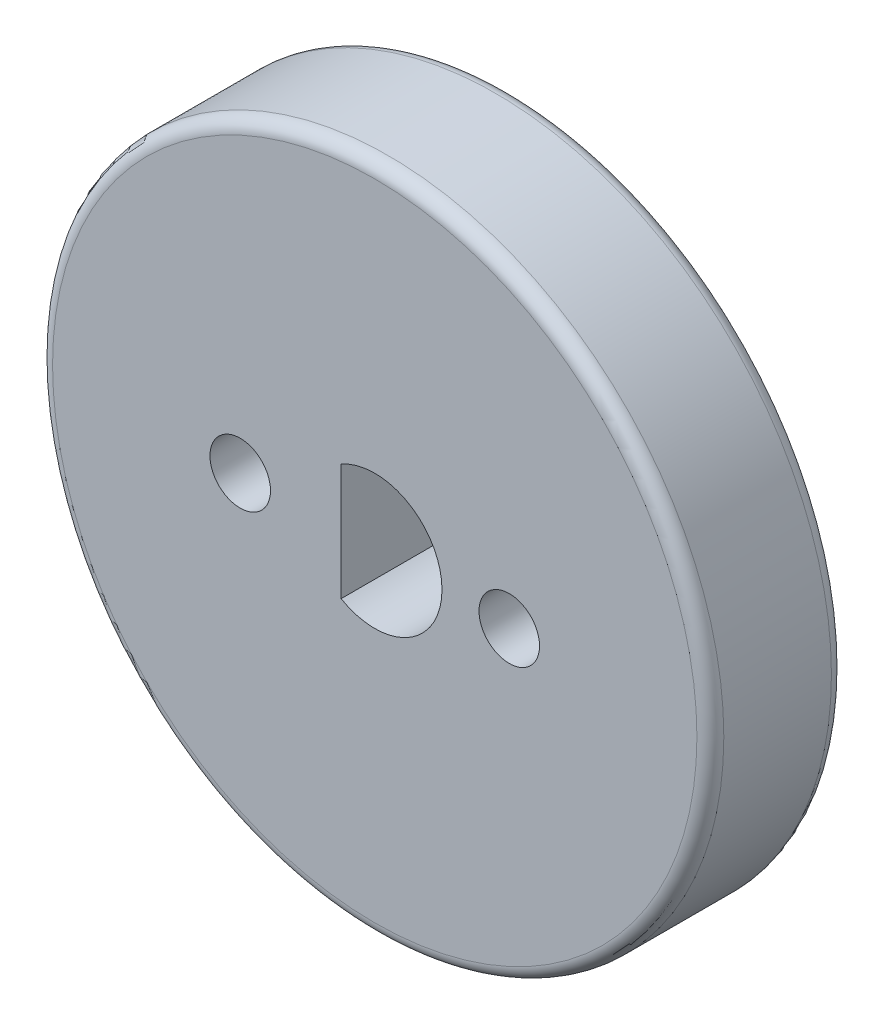
ISO-10303-21;
HEADER;
FILE_DESCRIPTION(('STEP AP214'),'2;1');
FILE_NAME('part.step','',(''),(''),'','','');
FILE_SCHEMA(('AUTOMOTIVE_DESIGN { 1 0 10303 214 1 1 1 1 }'));
ENDSEC;
DATA;
#1=APPLICATION_CONTEXT('core data for automotive mechanical design processes');
#2=APPLICATION_PROTOCOL_DEFINITION('international standard','automotive_design',2000,#1);
#3=PRODUCT_CONTEXT('',#1,'mechanical');
#4=PRODUCT('Part','Part','',(#3));
#5=PRODUCT_RELATED_PRODUCT_CATEGORY('part','',(#4));
#6=PRODUCT_DEFINITION_FORMATION('','',#4);
#7=PRODUCT_DEFINITION_CONTEXT('part definition',#1,'design');
#8=PRODUCT_DEFINITION('design','',#6,#7);
#9=PRODUCT_DEFINITION_SHAPE('','',#8);
#10=(LENGTH_UNIT() NAMED_UNIT(*) SI_UNIT(.MILLI.,.METRE.));
#11=(NAMED_UNIT(*) PLANE_ANGLE_UNIT() SI_UNIT($,.RADIAN.));
#12=(NAMED_UNIT(*) SI_UNIT($,.STERADIAN.) SOLID_ANGLE_UNIT());
#13=UNCERTAINTY_MEASURE_WITH_UNIT(LENGTH_MEASURE(1.E-05),#10,'distance_accuracy_value','');
#14=(GEOMETRIC_REPRESENTATION_CONTEXT(3) GLOBAL_UNCERTAINTY_ASSIGNED_CONTEXT((#13)) GLOBAL_UNIT_ASSIGNED_CONTEXT((#10,
#11,#12)) REPRESENTATION_CONTEXT('',''));
#15=CARTESIAN_POINT('',(0.,0.,0.));
#16=DIRECTION('',(0.,0.,1.));
#17=DIRECTION('',(1.,0.,0.));
#18=AXIS2_PLACEMENT_3D('',#15,#16,#17);
#19=CARTESIAN_POINT('',(0.,0.,0.));
#20=DIRECTION('',(0.,0.,1.));
#21=DIRECTION('',(1.,0.,0.));
#22=AXIS2_PLACEMENT_3D('',#19,#20,#21);
#23=PLANE('',#22);
#24=CARTESIAN_POINT('',(0.,0.,0.));
#25=DIRECTION('',(0.,0.,1.));
#26=DIRECTION('',(1.,0.,0.));
#27=AXIS2_PLACEMENT_3D('',#24,#25,#26);
#28=CIRCLE('',#27,23.95);
#29=CARTESIAN_POINT('',(23.95,0.,0.));
#30=VERTEX_POINT('',#29);
#31=EDGE_CURVE('E11',#30,#30,#28,.F.);
#32=ORIENTED_EDGE('',*,*,#31,.T.);
#33=EDGE_LOOP('',(#32));
#34=FACE_BOUND('',#33,.T.);
#35=CARTESIAN_POINT('',(0.,15.,0.));
#36=DIRECTION('',(0.,0.,1.));
#37=DIRECTION('',(1.,0.,0.));
#38=AXIS2_PLACEMENT_3D('',#35,#36,#37);
#39=CIRCLE('',#38,2.25);
#40=CARTESIAN_POINT('',(2.25,15.,0.));
#41=VERTEX_POINT('',#40);
#42=EDGE_CURVE('E104',#41,#41,#39,.T.);
#43=ORIENTED_EDGE('',*,*,#42,.T.);
#44=EDGE_LOOP('',(#43));
#45=FACE_BOUND('',#44,.T.);
#46=CARTESIAN_POINT('',(0.,0.,0.));
#47=DIRECTION('',(0.,0.,1.));
#48=DIRECTION('',(1.,0.,0.));
#49=AXIS2_PLACEMENT_3D('',#46,#47,#48);
#50=CIRCLE('',#49,5.);
#51=CARTESIAN_POINT('',(-2.50000000000002,-4.33012701892218,0.));
#52=VERTEX_POINT('',#51);
#53=CARTESIAN_POINT('',(-2.50000000000002,4.33012701892218,0.));
#54=VERTEX_POINT('',#53);
#55=EDGE_CURVE('E61',#52,#54,#50,.T.);
#56=ORIENTED_EDGE('',*,*,#55,.T.);
#57=DIRECTION('',(0.,-1.,0.));
#58=VECTOR('',#57,1.);
#59=CARTESIAN_POINT('',(-2.50000000000002,-4.33012701892218,0.));
#60=LINE('',#59,#58);
#61=EDGE_CURVE('E72',#54,#52,#60,.T.);
#62=ORIENTED_EDGE('',*,*,#61,.T.);
#63=EDGE_LOOP('',(#56,#62));
#64=FACE_BOUND('',#63,.T.);
#65=CARTESIAN_POINT('',(12.9903810567666,-7.49999999999999,0.));
#66=DIRECTION('',(0.,0.,1.));
#67=DIRECTION('',(1.,0.,0.));
#68=AXIS2_PLACEMENT_3D('',#65,#66,#67);
#69=CIRCLE('',#68,2.25);
#70=CARTESIAN_POINT('',(15.2403810567666,-7.49999999999999,0.));
#71=VERTEX_POINT('',#70);
#72=EDGE_CURVE('E95',#71,#71,#69,.T.);
#73=ORIENTED_EDGE('',*,*,#72,.T.);
#74=EDGE_LOOP('',(#73));
#75=FACE_BOUND('',#74,.T.);
#76=CARTESIAN_POINT('',(-12.9903810567666,-7.50000000000001,0.));
#77=DIRECTION('',(0.,0.,1.));
#78=DIRECTION('',(1.,0.,0.));
#79=AXIS2_PLACEMENT_3D('',#76,#77,#78);
#80=CIRCLE('',#79,2.25);
#81=CARTESIAN_POINT('',(-10.7403810567666,-7.50000000000001,0.));
#82=VERTEX_POINT('',#81);
#83=EDGE_CURVE('E92',#82,#82,#80,.T.);
#84=ORIENTED_EDGE('',*,*,#83,.T.);
#85=EDGE_LOOP('',(#84));
#86=FACE_BOUND('',#85,.T.);
#87=ADVANCED_FACE('F39',(#34,#45,#64,#75,#86),#23,.F.);
#88=CARTESIAN_POINT('',(0.,0.,6.));
#89=DIRECTION('',(0.,0.,-1.));
#90=DIRECTION('',(-1.,0.,0.));
#91=AXIS2_PLACEMENT_3D('',#88,#89,#90);
#92=CYLINDRICAL_SURFACE('',#91,24.95);
#93=CARTESIAN_POINT('',(0.,0.,9.));
#94=DIRECTION('',(0.,0.,1.));
#95=DIRECTION('',(1.,0.,0.));
#96=AXIS2_PLACEMENT_3D('',#93,#94,#95);
#97=CIRCLE('',#96,24.95);
#98=CARTESIAN_POINT('',(24.95,0.,9.));
#99=VERTEX_POINT('',#98);
#100=EDGE_CURVE('E47',#99,#99,#97,.F.);
#101=ORIENTED_EDGE('',*,*,#100,.T.);
#102=EDGE_LOOP('',(#101));
#103=FACE_BOUND('',#102,.T.);
#104=CARTESIAN_POINT('',(0.,0.,1.));
#105=DIRECTION('',(0.,0.,1.));
#106=DIRECTION('',(1.,0.,0.));
#107=AXIS2_PLACEMENT_3D('',#104,#105,#106);
#108=CIRCLE('',#107,24.95);
#109=CARTESIAN_POINT('',(24.95,0.,1.));
#110=VERTEX_POINT('',#109);
#111=EDGE_CURVE('E112',#110,#110,#108,.T.);
#112=ORIENTED_EDGE('',*,*,#111,.T.);
#113=EDGE_LOOP('',(#112));
#114=FACE_BOUND('',#113,.T.);
#115=ADVANCED_FACE('F117',(#103,#114),#92,.T.);
#116=CARTESIAN_POINT('',(0.,15.,6.));
#117=DIRECTION('',(0.,0.,-1.));
#118=DIRECTION('',(-1.,0.,0.));
#119=AXIS2_PLACEMENT_3D('',#116,#117,#118);
#120=CYLINDRICAL_SURFACE('',#119,2.25);
#121=CARTESIAN_POINT('',(0.,15.,6.));
#122=DIRECTION('',(0.,0.,1.));
#123=DIRECTION('',(1.,0.,0.));
#124=AXIS2_PLACEMENT_3D('',#121,#122,#123);
#125=CIRCLE('',#124,2.25);
#126=CARTESIAN_POINT('',(2.25,15.,6.));
#127=VERTEX_POINT('',#126);
#128=EDGE_CURVE('E91',#127,#127,#125,.T.);
#129=ORIENTED_EDGE('',*,*,#128,.T.);
#130=EDGE_LOOP('',(#129));
#131=FACE_BOUND('',#130,.T.);
#132=ORIENTED_EDGE('',*,*,#42,.F.);
#133=EDGE_LOOP('',(#132));
#134=FACE_BOUND('',#133,.T.);
#135=ADVANCED_FACE('F160',(#131,#134),#120,.F.);
#136=CARTESIAN_POINT('',(0.,0.,6.));
#137=DIRECTION('',(0.,0.,-1.));
#138=DIRECTION('',(-1.,0.,0.));
#139=AXIS2_PLACEMENT_3D('',#136,#137,#138);
#140=CYLINDRICAL_SURFACE('',#139,5.);
#141=ORIENTED_EDGE('',*,*,#55,.F.);
#142=DIRECTION('',(0.,0.,-1.));
#143=VECTOR('',#142,1.);
#144=CARTESIAN_POINT('',(-2.50000000000002,-4.33012701892218,6.));
#145=LINE('',#144,#143);
#146=CARTESIAN_POINT('',(-2.50000000000002,-4.33012701892218,10.));
#147=VERTEX_POINT('',#146);
#148=EDGE_CURVE('E66',#147,#52,#145,.T.);
#149=ORIENTED_EDGE('',*,*,#148,.F.);
#150=CARTESIAN_POINT('',(0.,0.,10.));
#151=DIRECTION('',(0.,0.,-1.));
#152=DIRECTION('',(-1.,0.,0.));
#153=AXIS2_PLACEMENT_3D('',#150,#151,#152);
#154=CIRCLE('',#153,5.);
#155=CARTESIAN_POINT('',(-2.50000000000002,4.33012701892218,10.));
#156=VERTEX_POINT('',#155);
#157=EDGE_CURVE('E69',#156,#147,#154,.T.);
#158=ORIENTED_EDGE('',*,*,#157,.F.);
#159=DIRECTION('',(0.,0.,-1.));
#160=VECTOR('',#159,1.);
#161=CARTESIAN_POINT('',(-2.50000000000002,4.33012701892218,6.));
#162=LINE('',#161,#160);
#163=EDGE_CURVE('E54',#156,#54,#162,.T.);
#164=ORIENTED_EDGE('',*,*,#163,.T.);
#165=EDGE_LOOP('',(#141,#149,#158,#164));
#166=FACE_BOUND('',#165,.T.);
#167=ADVANCED_FACE('F67',(#166),#140,.F.);
#168=CARTESIAN_POINT('',(-2.50000000000002,-4.33012701892218,6.));
#169=DIRECTION('',(1.,0.,0.));
#170=DIRECTION('',(0.,0.,-1.));
#171=AXIS2_PLACEMENT_3D('',#168,#169,#170);
#172=PLANE('',#171);
#173=ORIENTED_EDGE('',*,*,#61,.F.);
#174=ORIENTED_EDGE('',*,*,#163,.F.);
#175=DIRECTION('',(0.,1.,0.));
#176=VECTOR('',#175,1.);
#177=CARTESIAN_POINT('',(-2.50000000000002,4.33012701892218,10.));
#178=LINE('',#177,#176);
#179=EDGE_CURVE('E74',#147,#156,#178,.T.);
#180=ORIENTED_EDGE('',*,*,#179,.F.);
#181=ORIENTED_EDGE('',*,*,#148,.T.);
#182=EDGE_LOOP('',(#173,#174,#180,#181));
#183=FACE_BOUND('',#182,.T.);
#184=ADVANCED_FACE('F75',(#183),#172,.T.);
#185=CARTESIAN_POINT('',(12.9903810567666,-7.49999999999999,6.));
#186=DIRECTION('',(0.,0.,-1.));
#187=DIRECTION('',(-1.,0.,0.));
#188=AXIS2_PLACEMENT_3D('',#185,#186,#187);
#189=CYLINDRICAL_SURFACE('',#188,2.25);
#190=CARTESIAN_POINT('',(12.9903810567666,-7.49999999999999,6.));
#191=DIRECTION('',(0.,0.,1.));
#192=DIRECTION('',(1.,0.,0.));
#193=AXIS2_PLACEMENT_3D('',#190,#191,#192);
#194=CIRCLE('',#193,2.25);
#195=CARTESIAN_POINT('',(15.2403810567666,-7.49999999999999,6.));
#196=VERTEX_POINT('',#195);
#197=EDGE_CURVE('E96',#196,#196,#194,.T.);
#198=ORIENTED_EDGE('',*,*,#197,.T.);
#199=EDGE_LOOP('',(#198));
#200=FACE_BOUND('',#199,.T.);
#201=ORIENTED_EDGE('',*,*,#72,.F.);
#202=EDGE_LOOP('',(#201));
#203=FACE_BOUND('',#202,.T.);
#204=ADVANCED_FACE('F170',(#200,#203),#189,.F.);
#205=CARTESIAN_POINT('',(-12.9903810567666,-7.50000000000001,6.));
#206=DIRECTION('',(0.,0.,-1.));
#207=DIRECTION('',(-1.,0.,0.));
#208=AXIS2_PLACEMENT_3D('',#205,#206,#207);
#209=CYLINDRICAL_SURFACE('',#208,2.25);
#210=CARTESIAN_POINT('',(-12.9903810567666,-7.50000000000001,6.));
#211=DIRECTION('',(0.,0.,1.));
#212=DIRECTION('',(1.,0.,0.));
#213=AXIS2_PLACEMENT_3D('',#210,#211,#212);
#214=CIRCLE('',#213,2.25);
#215=CARTESIAN_POINT('',(-10.7403810567666,-7.50000000000001,6.));
#216=VERTEX_POINT('',#215);
#217=EDGE_CURVE('E77',#216,#216,#214,.T.);
#218=ORIENTED_EDGE('',*,*,#217,.T.);
#219=EDGE_LOOP('',(#218));
#220=FACE_BOUND('',#219,.T.);
#221=ORIENTED_EDGE('',*,*,#83,.F.);
#222=EDGE_LOOP('',(#221));
#223=FACE_BOUND('',#222,.T.);
#224=ADVANCED_FACE('F173',(#220,#223),#209,.F.);
#225=CARTESIAN_POINT('',(0.,0.,6.));
#226=DIRECTION('',(0.,0.,1.));
#227=DIRECTION('',(1.,0.,0.));
#228=AXIS2_PLACEMENT_3D('',#225,#226,#227);
#229=PLANE('',#228);
#230=ORIENTED_EDGE('',*,*,#217,.F.);
#231=EDGE_LOOP('',(#230));
#232=FACE_BOUND('',#231,.T.);
#233=ADVANCED_FACE('F177',(#232),#229,.F.);
#234=ORIENTED_EDGE('',*,*,#128,.F.);
#235=EDGE_LOOP('',(#234));
#236=FACE_BOUND('',#235,.T.);
#237=ADVANCED_FACE('F180',(#236),#229,.F.);
#238=ORIENTED_EDGE('',*,*,#197,.F.);
#239=EDGE_LOOP('',(#238));
#240=FACE_BOUND('',#239,.T.);
#241=ADVANCED_FACE('F129',(#240),#229,.F.);
#242=CARTESIAN_POINT('',(0.,0.,10.));
#243=DIRECTION('',(0.,0.,1.));
#244=DIRECTION('',(1.,0.,0.));
#245=AXIS2_PLACEMENT_3D('',#242,#243,#244);
#246=PLANE('',#245);
#247=CARTESIAN_POINT('',(0.,0.,10.));
#248=DIRECTION('',(0.,0.,1.));
#249=DIRECTION('',(1.,0.,0.));
#250=AXIS2_PLACEMENT_3D('',#247,#248,#249);
#251=CIRCLE('',#250,23.95);
#252=CARTESIAN_POINT('',(23.95,0.,10.));
#253=VERTEX_POINT('',#252);
#254=EDGE_CURVE('E109',#253,#253,#251,.T.);
#255=ORIENTED_EDGE('',*,*,#254,.T.);
#256=EDGE_LOOP('',(#255));
#257=FACE_BOUND('',#256,.T.);
#258=CARTESIAN_POINT('',(-10.,0.,10.));
#259=DIRECTION('',(0.,0.,1.));
#260=DIRECTION('',(1.,0.,0.));
#261=AXIS2_PLACEMENT_3D('',#258,#259,#260);
#262=CIRCLE('',#261,2.25);
#263=CARTESIAN_POINT('',(-7.75,0.,10.));
#264=VERTEX_POINT('',#263);
#265=EDGE_CURVE('E83',#264,#264,#262,.T.);
#266=ORIENTED_EDGE('',*,*,#265,.F.);
#267=EDGE_LOOP('',(#266));
#268=FACE_BOUND('',#267,.T.);
#269=CARTESIAN_POINT('',(10.,0.,10.));
#270=DIRECTION('',(0.,0.,1.));
#271=DIRECTION('',(1.,0.,0.));
#272=AXIS2_PLACEMENT_3D('',#269,#270,#271);
#273=CIRCLE('',#272,2.25);
#274=CARTESIAN_POINT('',(12.25,0.,10.));
#275=VERTEX_POINT('',#274);
#276=EDGE_CURVE('E136',#275,#275,#273,.T.);
#277=ORIENTED_EDGE('',*,*,#276,.F.);
#278=EDGE_LOOP('',(#277));
#279=FACE_BOUND('',#278,.T.);
#280=ORIENTED_EDGE('',*,*,#157,.T.);
#281=ORIENTED_EDGE('',*,*,#179,.T.);
#282=EDGE_LOOP('',(#280,#281));
#283=FACE_BOUND('',#282,.T.);
#284=ADVANCED_FACE('F79',(#257,#268,#279,#283),#246,.T.);
#285=CARTESIAN_POINT('',(10.,0.,4.));
#286=DIRECTION('',(0.,0.,1.));
#287=DIRECTION('',(1.,0.,0.));
#288=AXIS2_PLACEMENT_3D('',#285,#286,#287);
#289=CYLINDRICAL_SURFACE('',#288,2.25);
#290=CARTESIAN_POINT('',(10.,0.,4.));
#291=DIRECTION('',(0.,0.,1.));
#292=DIRECTION('',(1.,0.,0.));
#293=AXIS2_PLACEMENT_3D('',#290,#291,#292);
#294=CIRCLE('',#293,2.25);
#295=CARTESIAN_POINT('',(12.25,0.,4.));
#296=VERTEX_POINT('',#295);
#297=EDGE_CURVE('E86',#296,#296,#294,.T.);
#298=ORIENTED_EDGE('',*,*,#297,.F.);
#299=EDGE_LOOP('',(#298));
#300=FACE_BOUND('',#299,.T.);
#301=ORIENTED_EDGE('',*,*,#276,.T.);
#302=EDGE_LOOP('',(#301));
#303=FACE_BOUND('',#302,.T.);
#304=ADVANCED_FACE('F128',(#300,#303),#289,.F.);
#305=CARTESIAN_POINT('',(10.,0.,4.));
#306=DIRECTION('',(0.,0.,1.));
#307=DIRECTION('',(1.,0.,0.));
#308=AXIS2_PLACEMENT_3D('',#305,#306,#307);
#309=PLANE('',#308);
#310=ORIENTED_EDGE('',*,*,#297,.T.);
#311=EDGE_LOOP('',(#310));
#312=FACE_BOUND('',#311,.T.);
#313=ADVANCED_FACE('F142',(#312),#309,.T.);
#314=CARTESIAN_POINT('',(-10.,0.,4.));
#315=DIRECTION('',(0.,0.,1.));
#316=DIRECTION('',(1.,0.,0.));
#317=AXIS2_PLACEMENT_3D('',#314,#315,#316);
#318=CYLINDRICAL_SURFACE('',#317,2.25);
#319=CARTESIAN_POINT('',(-10.,0.,4.));
#320=DIRECTION('',(0.,0.,1.));
#321=DIRECTION('',(1.,0.,0.));
#322=AXIS2_PLACEMENT_3D('',#319,#320,#321);
#323=CIRCLE('',#322,2.25);
#324=CARTESIAN_POINT('',(-7.75,0.,4.));
#325=VERTEX_POINT('',#324);
#326=EDGE_CURVE('E80',#325,#325,#323,.T.);
#327=ORIENTED_EDGE('',*,*,#326,.F.);
#328=EDGE_LOOP('',(#327));
#329=FACE_BOUND('',#328,.T.);
#330=ORIENTED_EDGE('',*,*,#265,.T.);
#331=EDGE_LOOP('',(#330));
#332=FACE_BOUND('',#331,.T.);
#333=ADVANCED_FACE('F150',(#329,#332),#318,.F.);
#334=CARTESIAN_POINT('',(-10.,0.,4.));
#335=DIRECTION('',(0.,0.,1.));
#336=DIRECTION('',(1.,0.,0.));
#337=AXIS2_PLACEMENT_3D('',#334,#335,#336);
#338=PLANE('',#337);
#339=ORIENTED_EDGE('',*,*,#326,.T.);
#340=EDGE_LOOP('',(#339));
#341=FACE_BOUND('',#340,.T.);
#342=ADVANCED_FACE('F123',(#341),#338,.T.);
#343=CARTESIAN_POINT('',(0.,0.,9.));
#344=DIRECTION('',(0.,0.,1.));
#345=DIRECTION('',(1.,0.,0.));
#346=AXIS2_PLACEMENT_3D('',#343,#344,#345);
#347=TOROIDAL_SURFACE('',#346,23.95,1.);
#348=ORIENTED_EDGE('',*,*,#100,.F.);
#349=EDGE_LOOP('',(#348));
#350=FACE_BOUND('',#349,.T.);
#351=ORIENTED_EDGE('',*,*,#254,.F.);
#352=EDGE_LOOP('',(#351));
#353=FACE_BOUND('',#352,.T.);
#354=ADVANCED_FACE('F120',(#350,#353),#347,.T.);
#355=CARTESIAN_POINT('',(0.,0.,1.));
#356=DIRECTION('',(0.,0.,1.));
#357=DIRECTION('',(1.,0.,0.));
#358=AXIS2_PLACEMENT_3D('',#355,#356,#357);
#359=TOROIDAL_SURFACE('',#358,23.95,1.);
#360=ORIENTED_EDGE('',*,*,#31,.F.);
#361=EDGE_LOOP('',(#360));
#362=FACE_BOUND('',#361,.T.);
#363=ORIENTED_EDGE('',*,*,#111,.F.);
#364=EDGE_LOOP('',(#363));
#365=FACE_BOUND('',#364,.T.);
#366=ADVANCED_FACE('F41',(#362,#365),#359,.T.);
#367=CLOSED_SHELL('',(#87,#115,#135,#167,#184,#204,#224,#233,#237,#241,#284,#304,#313,#333,#342,
#354,#366));
#368=MANIFOLD_SOLID_BREP('B2',#367);
#369=ADVANCED_BREP_SHAPE_REPRESENTATION('',(#18,#368),#14);
#370=SHAPE_DEFINITION_REPRESENTATION(#9,#369);
ENDSEC;
END-ISO-10303-21;
